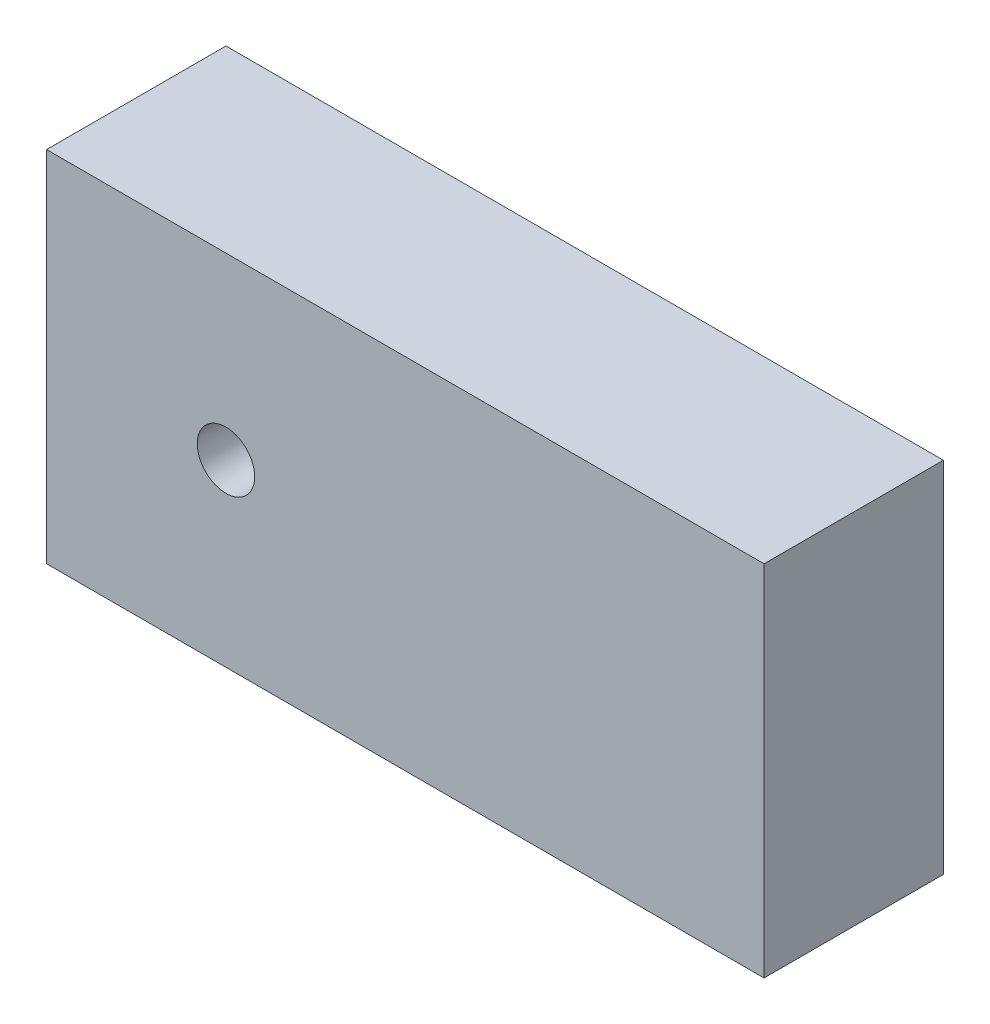
ISO-10303-21;
HEADER;
FILE_DESCRIPTION(('STEP AP214'),'2;1');
FILE_NAME('part.step','',(''),(''),'','','');
FILE_SCHEMA(('AUTOMOTIVE_DESIGN { 1 0 10303 214 1 1 1 1 }'));
ENDSEC;
DATA;
#1=APPLICATION_CONTEXT('core data for automotive mechanical design processes');
#2=APPLICATION_PROTOCOL_DEFINITION('international standard','automotive_design',2000,#1);
#3=PRODUCT_CONTEXT('',#1,'mechanical');
#4=PRODUCT('Part','Part','',(#3));
#5=PRODUCT_RELATED_PRODUCT_CATEGORY('part','',(#4));
#6=PRODUCT_DEFINITION_FORMATION('','',#4);
#7=PRODUCT_DEFINITION_CONTEXT('part definition',#1,'design');
#8=PRODUCT_DEFINITION('design','',#6,#7);
#9=PRODUCT_DEFINITION_SHAPE('','',#8);
#10=(LENGTH_UNIT() NAMED_UNIT(*) SI_UNIT(.MILLI.,.METRE.));
#11=(NAMED_UNIT(*) PLANE_ANGLE_UNIT() SI_UNIT($,.RADIAN.));
#12=(NAMED_UNIT(*) SI_UNIT($,.STERADIAN.) SOLID_ANGLE_UNIT());
#13=UNCERTAINTY_MEASURE_WITH_UNIT(LENGTH_MEASURE(1.E-05),#10,'distance_accuracy_value','');
#14=(GEOMETRIC_REPRESENTATION_CONTEXT(3) GLOBAL_UNCERTAINTY_ASSIGNED_CONTEXT((#13)) GLOBAL_UNIT_ASSIGNED_CONTEXT((#10,
#11,#12)) REPRESENTATION_CONTEXT('',''));
#15=CARTESIAN_POINT('',(0.,0.,0.));
#16=DIRECTION('',(0.,0.,1.));
#17=DIRECTION('',(1.,0.,0.));
#18=AXIS2_PLACEMENT_3D('',#15,#16,#17);
#19=CARTESIAN_POINT('',(0.,0.,10.));
#20=DIRECTION('',(0.,0.,-1.));
#21=DIRECTION('',(-1.,0.,0.));
#22=AXIS2_PLACEMENT_3D('',#19,#20,#21);
#23=PLANE('',#22);
#24=DIRECTION('',(0.,-1.,0.));
#25=VECTOR('',#24,1.);
#26=CARTESIAN_POINT('',(0.,0.,10.));
#27=LINE('',#26,#25);
#28=CARTESIAN_POINT('',(0.,20.,10.));
#29=VERTEX_POINT('',#28);
#30=CARTESIAN_POINT('',(0.,0.,10.));
#31=VERTEX_POINT('',#30);
#32=EDGE_CURVE('E87',#29,#31,#27,.T.);
#33=ORIENTED_EDGE('',*,*,#32,.T.);
#34=DIRECTION('',(1.,0.,0.));
#35=VECTOR('',#34,1.);
#36=CARTESIAN_POINT('',(0.,0.,10.));
#37=LINE('',#36,#35);
#38=CARTESIAN_POINT('',(40.,0.,10.));
#39=VERTEX_POINT('',#38);
#40=EDGE_CURVE('E82',#31,#39,#37,.T.);
#41=ORIENTED_EDGE('',*,*,#40,.T.);
#42=DIRECTION('',(0.,1.,0.));
#43=VECTOR('',#42,1.);
#44=CARTESIAN_POINT('',(40.,0.,10.));
#45=LINE('',#44,#43);
#46=CARTESIAN_POINT('',(40.,20.,10.));
#47=VERTEX_POINT('',#46);
#48=EDGE_CURVE('E85',#39,#47,#45,.T.);
#49=ORIENTED_EDGE('',*,*,#48,.T.);
#50=DIRECTION('',(-1.,0.,0.));
#51=VECTOR('',#50,1.);
#52=CARTESIAN_POINT('',(0.,20.,10.));
#53=LINE('',#52,#51);
#54=EDGE_CURVE('E52',#47,#29,#53,.T.);
#55=ORIENTED_EDGE('',*,*,#54,.T.);
#56=EDGE_LOOP('',(#33,#41,#49,#55));
#57=FACE_BOUND('',#56,.T.);
#58=CARTESIAN_POINT('',(10.,10.,10.));
#59=DIRECTION('',(0.,0.,1.));
#60=DIRECTION('',(1.,0.,0.));
#61=AXIS2_PLACEMENT_3D('',#58,#59,#60);
#62=CIRCLE('',#61,1.6);
#63=CARTESIAN_POINT('',(11.6,10.,10.));
#64=VERTEX_POINT('',#63);
#65=EDGE_CURVE('E102',#64,#64,#62,.T.);
#66=ORIENTED_EDGE('',*,*,#65,.F.);
#67=EDGE_LOOP('',(#66));
#68=FACE_BOUND('',#67,.T.);
#69=ADVANCED_FACE('F35',(#57,#68),#23,.F.);
#70=CARTESIAN_POINT('',(0.,0.,0.));
#71=DIRECTION('',(0.,0.,-1.));
#72=DIRECTION('',(-1.,0.,0.));
#73=AXIS2_PLACEMENT_3D('',#70,#71,#72);
#74=PLANE('',#73);
#75=DIRECTION('',(0.,-1.,0.));
#76=VECTOR('',#75,1.);
#77=CARTESIAN_POINT('',(0.,0.,0.));
#78=LINE('',#77,#76);
#79=CARTESIAN_POINT('',(0.,20.,0.));
#80=VERTEX_POINT('',#79);
#81=CARTESIAN_POINT('',(0.,0.,0.));
#82=VERTEX_POINT('',#81);
#83=EDGE_CURVE('E99',#80,#82,#78,.T.);
#84=ORIENTED_EDGE('',*,*,#83,.F.);
#85=DIRECTION('',(-1.,0.,0.));
#86=VECTOR('',#85,1.);
#87=CARTESIAN_POINT('',(0.,20.,0.));
#88=LINE('',#87,#86);
#89=CARTESIAN_POINT('',(40.,20.,0.));
#90=VERTEX_POINT('',#89);
#91=EDGE_CURVE('E75',#90,#80,#88,.T.);
#92=ORIENTED_EDGE('',*,*,#91,.F.);
#93=DIRECTION('',(0.,1.,0.));
#94=VECTOR('',#93,1.);
#95=CARTESIAN_POINT('',(40.,0.,0.));
#96=LINE('',#95,#94);
#97=CARTESIAN_POINT('',(40.,0.,0.));
#98=VERTEX_POINT('',#97);
#99=EDGE_CURVE('E69',#98,#90,#96,.T.);
#100=ORIENTED_EDGE('',*,*,#99,.F.);
#101=DIRECTION('',(1.,0.,0.));
#102=VECTOR('',#101,1.);
#103=CARTESIAN_POINT('',(0.,0.,0.));
#104=LINE('',#103,#102);
#105=EDGE_CURVE('E91',#82,#98,#104,.T.);
#106=ORIENTED_EDGE('',*,*,#105,.F.);
#107=EDGE_LOOP('',(#84,#92,#100,#106));
#108=FACE_BOUND('',#107,.T.);
#109=CARTESIAN_POINT('',(10.,10.,0.));
#110=DIRECTION('',(0.,0.,1.));
#111=DIRECTION('',(1.,0.,0.));
#112=AXIS2_PLACEMENT_3D('',#109,#110,#111);
#113=CIRCLE('',#112,1.6);
#114=CARTESIAN_POINT('',(11.6,10.,0.));
#115=VERTEX_POINT('',#114);
#116=EDGE_CURVE('E114',#115,#115,#113,.T.);
#117=ORIENTED_EDGE('',*,*,#116,.T.);
#118=EDGE_LOOP('',(#117));
#119=FACE_BOUND('',#118,.T.);
#120=ADVANCED_FACE('F110',(#108,#119),#74,.T.);
#121=CARTESIAN_POINT('',(0.,0.,10.));
#122=DIRECTION('',(1.,0.,0.));
#123=DIRECTION('',(0.,0.,-1.));
#124=AXIS2_PLACEMENT_3D('',#121,#122,#123);
#125=PLANE('',#124);
#126=ORIENTED_EDGE('',*,*,#83,.T.);
#127=DIRECTION('',(0.,0.,-1.));
#128=VECTOR('',#127,1.);
#129=CARTESIAN_POINT('',(0.,0.,10.));
#130=LINE('',#129,#128);
#131=EDGE_CURVE('E11',#31,#82,#130,.T.);
#132=ORIENTED_EDGE('',*,*,#131,.F.);
#133=ORIENTED_EDGE('',*,*,#32,.F.);
#134=DIRECTION('',(0.,0.,-1.));
#135=VECTOR('',#134,1.);
#136=CARTESIAN_POINT('',(0.,20.,10.));
#137=LINE('',#136,#135);
#138=EDGE_CURVE('E95',#29,#80,#137,.T.);
#139=ORIENTED_EDGE('',*,*,#138,.T.);
#140=EDGE_LOOP('',(#126,#132,#133,#139));
#141=FACE_BOUND('',#140,.T.);
#142=ADVANCED_FACE('F37',(#141),#125,.F.);
#143=CARTESIAN_POINT('',(0.,0.,10.));
#144=DIRECTION('',(0.,1.,0.));
#145=DIRECTION('',(0.,0.,1.));
#146=AXIS2_PLACEMENT_3D('',#143,#144,#145);
#147=PLANE('',#146);
#148=ORIENTED_EDGE('',*,*,#105,.T.);
#149=DIRECTION('',(0.,0.,-1.));
#150=VECTOR('',#149,1.);
#151=CARTESIAN_POINT('',(40.,0.,10.));
#152=LINE('',#151,#150);
#153=EDGE_CURVE('E44',#39,#98,#152,.T.);
#154=ORIENTED_EDGE('',*,*,#153,.F.);
#155=ORIENTED_EDGE('',*,*,#40,.F.);
#156=ORIENTED_EDGE('',*,*,#131,.T.);
#157=EDGE_LOOP('',(#148,#154,#155,#156));
#158=FACE_BOUND('',#157,.T.);
#159=ADVANCED_FACE('F90',(#158),#147,.F.);
#160=CARTESIAN_POINT('',(40.,0.,10.));
#161=DIRECTION('',(-1.,0.,0.));
#162=DIRECTION('',(0.,0.,1.));
#163=AXIS2_PLACEMENT_3D('',#160,#161,#162);
#164=PLANE('',#163);
#165=ORIENTED_EDGE('',*,*,#99,.T.);
#166=DIRECTION('',(0.,0.,-1.));
#167=VECTOR('',#166,1.);
#168=CARTESIAN_POINT('',(40.,20.,10.));
#169=LINE('',#168,#167);
#170=EDGE_CURVE('E92',#47,#90,#169,.T.);
#171=ORIENTED_EDGE('',*,*,#170,.F.);
#172=ORIENTED_EDGE('',*,*,#48,.F.);
#173=ORIENTED_EDGE('',*,*,#153,.T.);
#174=EDGE_LOOP('',(#165,#171,#172,#173));
#175=FACE_BOUND('',#174,.T.);
#176=ADVANCED_FACE('F93',(#175),#164,.F.);
#177=CARTESIAN_POINT('',(0.,20.,10.));
#178=DIRECTION('',(0.,-1.,0.));
#179=DIRECTION('',(0.,0.,-1.));
#180=AXIS2_PLACEMENT_3D('',#177,#178,#179);
#181=PLANE('',#180);
#182=ORIENTED_EDGE('',*,*,#91,.T.);
#183=ORIENTED_EDGE('',*,*,#138,.F.);
#184=ORIENTED_EDGE('',*,*,#54,.F.);
#185=ORIENTED_EDGE('',*,*,#170,.T.);
#186=EDGE_LOOP('',(#182,#183,#184,#185));
#187=FACE_BOUND('',#186,.T.);
#188=ADVANCED_FACE('F107',(#187),#181,.F.);
#189=CARTESIAN_POINT('',(10.,10.,10.));
#190=DIRECTION('',(0.,0.,-1.));
#191=DIRECTION('',(-1.,0.,0.));
#192=AXIS2_PLACEMENT_3D('',#189,#190,#191);
#193=CYLINDRICAL_SURFACE('',#192,1.6);
#194=ORIENTED_EDGE('',*,*,#65,.T.);
#195=EDGE_LOOP('',(#194));
#196=FACE_BOUND('',#195,.T.);
#197=ORIENTED_EDGE('',*,*,#116,.F.);
#198=EDGE_LOOP('',(#197));
#199=FACE_BOUND('',#198,.T.);
#200=ADVANCED_FACE('F120',(#196,#199),#193,.F.);
#201=CLOSED_SHELL('',(#69,#120,#142,#159,#176,#188,#200));
#202=MANIFOLD_SOLID_BREP('B2',#201);
#203=ADVANCED_BREP_SHAPE_REPRESENTATION('',(#18,#202),#14);
#204=SHAPE_DEFINITION_REPRESENTATION(#9,#203);
ENDSEC;
END-ISO-10303-21;
